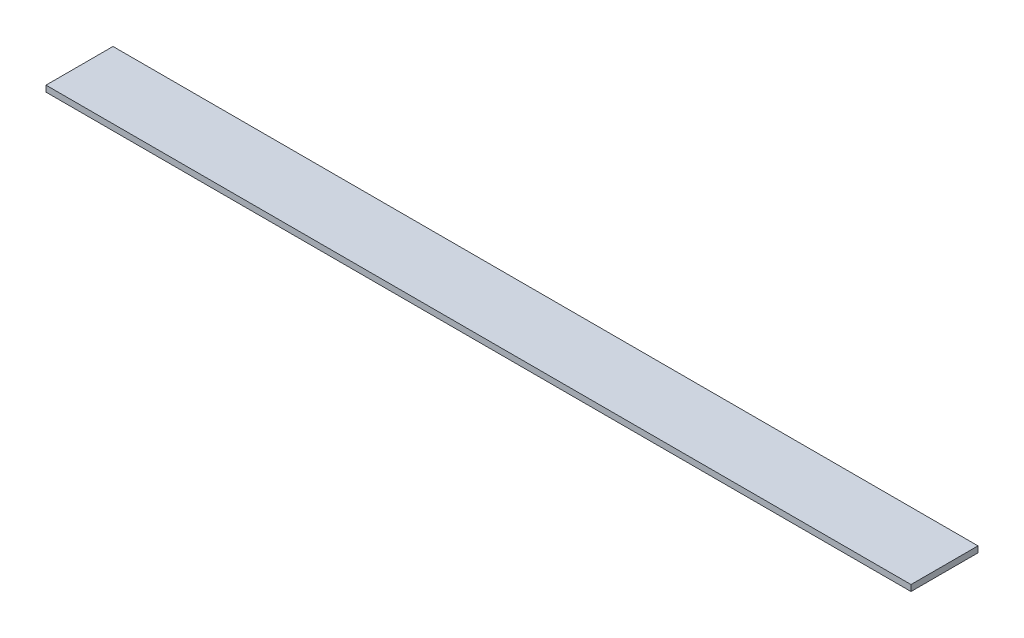
ISO-10303-21;
HEADER;
FILE_DESCRIPTION(('STEP AP214'),'2;1');
FILE_NAME('part.step','',(''),(''),'','','');
FILE_SCHEMA(('AUTOMOTIVE_DESIGN { 1 0 10303 214 1 1 1 1 }'));
ENDSEC;
DATA;
#1=APPLICATION_CONTEXT('core data for automotive mechanical design processes');
#2=APPLICATION_PROTOCOL_DEFINITION('international standard','automotive_design',2000,#1);
#3=PRODUCT_CONTEXT('',#1,'mechanical');
#4=PRODUCT('Part','Part','',(#3));
#5=PRODUCT_RELATED_PRODUCT_CATEGORY('part','',(#4));
#6=PRODUCT_DEFINITION_FORMATION('','',#4);
#7=PRODUCT_DEFINITION_CONTEXT('part definition',#1,'design');
#8=PRODUCT_DEFINITION('design','',#6,#7);
#9=PRODUCT_DEFINITION_SHAPE('','',#8);
#10=(LENGTH_UNIT() NAMED_UNIT(*) SI_UNIT(.MILLI.,.METRE.));
#11=(NAMED_UNIT(*) PLANE_ANGLE_UNIT() SI_UNIT($,.RADIAN.));
#12=(NAMED_UNIT(*) SI_UNIT($,.STERADIAN.) SOLID_ANGLE_UNIT());
#13=UNCERTAINTY_MEASURE_WITH_UNIT(LENGTH_MEASURE(1.E-05),#10,'distance_accuracy_value','');
#14=(GEOMETRIC_REPRESENTATION_CONTEXT(3) GLOBAL_UNCERTAINTY_ASSIGNED_CONTEXT((#13)) GLOBAL_UNIT_ASSIGNED_CONTEXT((#10,
#11,#12)) REPRESENTATION_CONTEXT('',''));
#15=CARTESIAN_POINT('',(0.,0.,0.));
#16=DIRECTION('',(0.,0.,1.));
#17=DIRECTION('',(1.,0.,0.));
#18=AXIS2_PLACEMENT_3D('',#15,#16,#17);
#19=CARTESIAN_POINT('',(0.,3.175,0.));
#20=DIRECTION('',(1.,0.,0.));
#21=DIRECTION('',(0.,0.,-1.));
#22=AXIS2_PLACEMENT_3D('',#19,#20,#21);
#23=PLANE('',#22);
#24=DIRECTION('',(0.,0.,1.));
#25=VECTOR('',#24,1.);
#26=CARTESIAN_POINT('',(0.,0.,0.));
#27=LINE('',#26,#25);
#28=CARTESIAN_POINT('',(0.,0.,-34.925));
#29=VERTEX_POINT('',#28);
#30=CARTESIAN_POINT('',(0.,0.,0.));
#31=VERTEX_POINT('',#30);
#32=EDGE_CURVE('E96',#29,#31,#27,.T.);
#33=ORIENTED_EDGE('',*,*,#32,.T.);
#34=DIRECTION('',(0.,-1.,0.));
#35=VECTOR('',#34,1.);
#36=CARTESIAN_POINT('',(0.,3.175,0.));
#37=LINE('',#36,#35);
#38=CARTESIAN_POINT('',(0.,3.175,0.));
#39=VERTEX_POINT('',#38);
#40=EDGE_CURVE('E11',#39,#31,#37,.T.);
#41=ORIENTED_EDGE('',*,*,#40,.F.);
#42=DIRECTION('',(0.,0.,1.));
#43=VECTOR('',#42,1.);
#44=CARTESIAN_POINT('',(0.,3.175,0.));
#45=LINE('',#44,#43);
#46=CARTESIAN_POINT('',(0.,3.175,-34.925));
#47=VERTEX_POINT('',#46);
#48=EDGE_CURVE('E84',#47,#39,#45,.T.);
#49=ORIENTED_EDGE('',*,*,#48,.F.);
#50=DIRECTION('',(0.,-1.,0.));
#51=VECTOR('',#50,1.);
#52=CARTESIAN_POINT('',(0.,3.175,-34.925));
#53=LINE('',#52,#51);
#54=EDGE_CURVE('E92',#47,#29,#53,.T.);
#55=ORIENTED_EDGE('',*,*,#54,.T.);
#56=EDGE_LOOP('',(#33,#41,#49,#55));
#57=FACE_BOUND('',#56,.T.);
#58=ADVANCED_FACE('F33',(#57),#23,.F.);
#59=CARTESIAN_POINT('',(0.,3.175,0.));
#60=DIRECTION('',(0.,0.,-1.));
#61=DIRECTION('',(-1.,0.,0.));
#62=AXIS2_PLACEMENT_3D('',#59,#60,#61);
#63=PLANE('',#62);
#64=DIRECTION('',(1.,0.,0.));
#65=VECTOR('',#64,1.);
#66=CARTESIAN_POINT('',(0.,0.,0.));
#67=LINE('',#66,#65);
#68=CARTESIAN_POINT('',(450.85,0.,0.));
#69=VERTEX_POINT('',#68);
#70=EDGE_CURVE('E88',#31,#69,#67,.T.);
#71=ORIENTED_EDGE('',*,*,#70,.T.);
#72=DIRECTION('',(0.,-1.,0.));
#73=VECTOR('',#72,1.);
#74=CARTESIAN_POINT('',(450.85,3.175,0.));
#75=LINE('',#74,#73);
#76=CARTESIAN_POINT('',(450.85,3.175,0.));
#77=VERTEX_POINT('',#76);
#78=EDGE_CURVE('E41',#77,#69,#75,.T.);
#79=ORIENTED_EDGE('',*,*,#78,.F.);
#80=DIRECTION('',(1.,0.,0.));
#81=VECTOR('',#80,1.);
#82=CARTESIAN_POINT('',(0.,3.175,0.));
#83=LINE('',#82,#81);
#84=EDGE_CURVE('E79',#39,#77,#83,.T.);
#85=ORIENTED_EDGE('',*,*,#84,.F.);
#86=ORIENTED_EDGE('',*,*,#40,.T.);
#87=EDGE_LOOP('',(#71,#79,#85,#86));
#88=FACE_BOUND('',#87,.T.);
#89=ADVANCED_FACE('F87',(#88),#63,.F.);
#90=CARTESIAN_POINT('',(450.85,3.175,0.));
#91=DIRECTION('',(-1.,0.,0.));
#92=DIRECTION('',(0.,0.,1.));
#93=AXIS2_PLACEMENT_3D('',#90,#91,#92);
#94=PLANE('',#93);
#95=DIRECTION('',(0.,0.,-1.));
#96=VECTOR('',#95,1.);
#97=CARTESIAN_POINT('',(450.85,0.,0.));
#98=LINE('',#97,#96);
#99=CARTESIAN_POINT('',(450.85,0.,-34.925));
#100=VERTEX_POINT('',#99);
#101=EDGE_CURVE('E66',#69,#100,#98,.T.);
#102=ORIENTED_EDGE('',*,*,#101,.T.);
#103=DIRECTION('',(0.,-1.,0.));
#104=VECTOR('',#103,1.);
#105=CARTESIAN_POINT('',(450.85,3.175,-34.925));
#106=LINE('',#105,#104);
#107=CARTESIAN_POINT('',(450.85,3.175,-34.925));
#108=VERTEX_POINT('',#107);
#109=EDGE_CURVE('E89',#108,#100,#106,.T.);
#110=ORIENTED_EDGE('',*,*,#109,.F.);
#111=DIRECTION('',(0.,0.,-1.));
#112=VECTOR('',#111,1.);
#113=CARTESIAN_POINT('',(450.85,3.175,0.));
#114=LINE('',#113,#112);
#115=EDGE_CURVE('E82',#77,#108,#114,.T.);
#116=ORIENTED_EDGE('',*,*,#115,.F.);
#117=ORIENTED_EDGE('',*,*,#78,.T.);
#118=EDGE_LOOP('',(#102,#110,#116,#117));
#119=FACE_BOUND('',#118,.T.);
#120=ADVANCED_FACE('F90',(#119),#94,.F.);
#121=CARTESIAN_POINT('',(0.,3.175,-34.925));
#122=DIRECTION('',(0.,0.,1.));
#123=DIRECTION('',(1.,0.,0.));
#124=AXIS2_PLACEMENT_3D('',#121,#122,#123);
#125=PLANE('',#124);
#126=DIRECTION('',(-1.,0.,0.));
#127=VECTOR('',#126,1.);
#128=CARTESIAN_POINT('',(0.,0.,-34.925));
#129=LINE('',#128,#127);
#130=EDGE_CURVE('E72',#100,#29,#129,.T.);
#131=ORIENTED_EDGE('',*,*,#130,.T.);
#132=ORIENTED_EDGE('',*,*,#54,.F.);
#133=DIRECTION('',(-1.,0.,0.));
#134=VECTOR('',#133,1.);
#135=CARTESIAN_POINT('',(0.,3.175,-34.925));
#136=LINE('',#135,#134);
#137=EDGE_CURVE('E49',#108,#47,#136,.T.);
#138=ORIENTED_EDGE('',*,*,#137,.F.);
#139=ORIENTED_EDGE('',*,*,#109,.T.);
#140=EDGE_LOOP('',(#131,#132,#138,#139));
#141=FACE_BOUND('',#140,.T.);
#142=ADVANCED_FACE('F103',(#141),#125,.F.);
#143=CARTESIAN_POINT('',(0.,3.175,-34.925));
#144=DIRECTION('',(0.,-1.,0.));
#145=DIRECTION('',(0.,0.,-1.));
#146=AXIS2_PLACEMENT_3D('',#143,#144,#145);
#147=PLANE('',#146);
#148=ORIENTED_EDGE('',*,*,#48,.T.);
#149=ORIENTED_EDGE('',*,*,#84,.T.);
#150=ORIENTED_EDGE('',*,*,#115,.T.);
#151=ORIENTED_EDGE('',*,*,#137,.T.);
#152=EDGE_LOOP('',(#148,#149,#150,#151));
#153=FACE_BOUND('',#152,.T.);
#154=ADVANCED_FACE('F80',(#153),#147,.F.);
#155=CARTESIAN_POINT('',(0.,0.,-34.925));
#156=DIRECTION('',(0.,-1.,0.));
#157=DIRECTION('',(0.,0.,-1.));
#158=AXIS2_PLACEMENT_3D('',#155,#156,#157);
#159=PLANE('',#158);
#160=ORIENTED_EDGE('',*,*,#32,.F.);
#161=ORIENTED_EDGE('',*,*,#130,.F.);
#162=ORIENTED_EDGE('',*,*,#101,.F.);
#163=ORIENTED_EDGE('',*,*,#70,.F.);
#164=EDGE_LOOP('',(#160,#161,#162,#163));
#165=FACE_BOUND('',#164,.T.);
#166=ADVANCED_FACE('F106',(#165),#159,.T.);
#167=CLOSED_SHELL('',(#58,#89,#120,#142,#154,#166));
#168=MANIFOLD_SOLID_BREP('B2',#167);
#169=ADVANCED_BREP_SHAPE_REPRESENTATION('',(#18,#168),#14);
#170=SHAPE_DEFINITION_REPRESENTATION(#9,#169);
ENDSEC;
END-ISO-10303-21;
